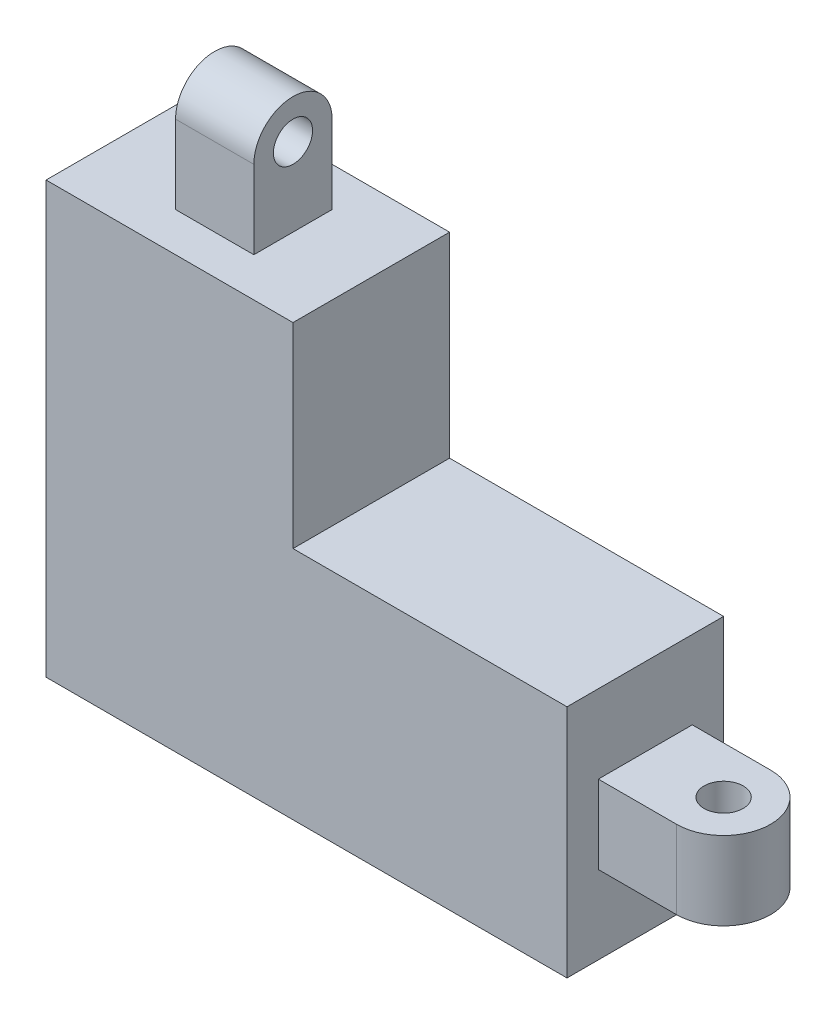
ISO-10303-21;
HEADER;
FILE_DESCRIPTION(('STEP AP214'),'2;1');
FILE_NAME('part.step','',(''),(''),'','','');
FILE_SCHEMA(('AUTOMOTIVE_DESIGN { 1 0 10303 214 1 1 1 1 }'));
ENDSEC;
DATA;
#1=APPLICATION_CONTEXT('core data for automotive mechanical design processes');
#2=APPLICATION_PROTOCOL_DEFINITION('international standard','automotive_design',2000,#1);
#3=PRODUCT_CONTEXT('',#1,'mechanical');
#4=PRODUCT('Part','Part','',(#3));
#5=PRODUCT_RELATED_PRODUCT_CATEGORY('part','',(#4));
#6=PRODUCT_DEFINITION_FORMATION('','',#4);
#7=PRODUCT_DEFINITION_CONTEXT('part definition',#1,'design');
#8=PRODUCT_DEFINITION('design','',#6,#7);
#9=PRODUCT_DEFINITION_SHAPE('','',#8);
#10=(LENGTH_UNIT() NAMED_UNIT(*) SI_UNIT(.MILLI.,.METRE.));
#11=(NAMED_UNIT(*) PLANE_ANGLE_UNIT() SI_UNIT($,.RADIAN.));
#12=(NAMED_UNIT(*) SI_UNIT($,.STERADIAN.) SOLID_ANGLE_UNIT());
#13=UNCERTAINTY_MEASURE_WITH_UNIT(LENGTH_MEASURE(1.E-05),#10,'distance_accuracy_value','');
#14=(GEOMETRIC_REPRESENTATION_CONTEXT(3) GLOBAL_UNCERTAINTY_ASSIGNED_CONTEXT((#13)) GLOBAL_UNIT_ASSIGNED_CONTEXT((#10,
#11,#12)) REPRESENTATION_CONTEXT('',''));
#15=CARTESIAN_POINT('',(0.,0.,0.));
#16=DIRECTION('',(0.,0.,1.));
#17=DIRECTION('',(1.,0.,0.));
#18=AXIS2_PLACEMENT_3D('',#15,#16,#17);
#19=CARTESIAN_POINT('',(48.2562905777485,477.466977070248,15.));
#20=DIRECTION('',(-1.,0.,0.));
#21=DIRECTION('',(0.,-1.,0.));
#22=AXIS2_PLACEMENT_3D('',#19,#20,#21);
#23=PLANE('',#22);
#24=DIRECTION('',(0.,0.,1.));
#25=VECTOR('',#24,1.);
#26=CARTESIAN_POINT('',(48.2562905777423,442.466977070252,-19.));
#27=LINE('',#26,#25);
#28=CARTESIAN_POINT('',(48.2562905777423,442.466977070252,-1.));
#29=VERTEX_POINT('',#28);
#30=CARTESIAN_POINT('',(48.2562905777423,442.466977070252,11.));
#31=VERTEX_POINT('',#30);
#32=EDGE_CURVE('E302',#29,#31,#27,.T.);
#33=ORIENTED_EDGE('',*,*,#32,.F.);
#34=DIRECTION('',(0.,-1.,0.));
#35=VECTOR('',#34,1.);
#36=CARTESIAN_POINT('',(48.2562905776773,-437.808884998721,-1.));
#37=LINE('',#36,#35);
#38=CARTESIAN_POINT('',(48.2562905777423,432.466977070252,-1.));
#39=VERTEX_POINT('',#38);
#40=EDGE_CURVE('E325',#29,#39,#37,.T.);
#41=ORIENTED_EDGE('',*,*,#40,.T.);
#42=DIRECTION('',(0.,0.,1.));
#43=VECTOR('',#42,1.);
#44=CARTESIAN_POINT('',(48.2562905777423,432.466977070252,-19.));
#45=LINE('',#44,#43);
#46=CARTESIAN_POINT('',(48.2562905777423,432.466977070252,11.));
#47=VERTEX_POINT('',#46);
#48=EDGE_CURVE('E298',#39,#47,#45,.T.);
#49=ORIENTED_EDGE('',*,*,#48,.T.);
#50=DIRECTION('',(0.,-1.,0.));
#51=VECTOR('',#50,1.);
#52=CARTESIAN_POINT('',(48.2562905776773,-437.808884998721,11.));
#53=LINE('',#52,#51);
#54=EDGE_CURVE('E209',#31,#47,#53,.T.);
#55=ORIENTED_EDGE('',*,*,#54,.F.);
#56=EDGE_LOOP('',(#33,#41,#49,#55));
#57=FACE_BOUND('',#56,.T.);
#58=DIRECTION('',(0.,0.,1.));
#59=VECTOR('',#58,1.);
#60=CARTESIAN_POINT('',(48.2562905777466,452.466977070253,-15.));
#61=LINE('',#60,#59);
#62=CARTESIAN_POINT('',(48.2562905777466,452.466977070253,-5.));
#63=VERTEX_POINT('',#62);
#64=CARTESIAN_POINT('',(48.2562905777466,452.466977070253,15.));
#65=VERTEX_POINT('',#64);
#66=EDGE_CURVE('E533',#63,#65,#61,.T.);
#67=ORIENTED_EDGE('',*,*,#66,.T.);
#68=DIRECTION('',(0.,1.,0.));
#69=VECTOR('',#68,1.);
#70=CARTESIAN_POINT('',(48.2562905777485,477.466977070248,15.));
#71=LINE('',#70,#69);
#72=CARTESIAN_POINT('',(48.2562905777442,422.466977070253,15.));
#73=VERTEX_POINT('',#72);
#74=EDGE_CURVE('E195',#73,#65,#71,.T.);
#75=ORIENTED_EDGE('',*,*,#74,.F.);
#76=DIRECTION('',(0.,0.,1.));
#77=VECTOR('',#76,1.);
#78=CARTESIAN_POINT('',(48.2562905777442,422.466977070253,-15.));
#79=LINE('',#78,#77);
#80=CARTESIAN_POINT('',(48.2562905777442,422.466977070253,-5.));
#81=VERTEX_POINT('',#80);
#82=EDGE_CURVE('E231',#81,#73,#79,.T.);
#83=ORIENTED_EDGE('',*,*,#82,.F.);
#84=DIRECTION('',(0.,1.,0.));
#85=VECTOR('',#84,1.);
#86=CARTESIAN_POINT('',(48.2562905777485,477.466977070248,-5.));
#87=LINE('',#86,#85);
#88=EDGE_CURVE('E205',#81,#63,#87,.T.);
#89=ORIENTED_EDGE('',*,*,#88,.T.);
#90=EDGE_LOOP('',(#67,#75,#83,#89));
#91=FACE_BOUND('',#90,.T.);
#92=ADVANCED_FACE('F70',(#57,#91),#23,.F.);
#93=CARTESIAN_POINT('',(1.1932964935929,-437.808884998718,15.));
#94=DIRECTION('',(0.,0.,1.));
#95=DIRECTION('',(1.,0.,0.));
#96=AXIS2_PLACEMENT_3D('',#93,#94,#95);
#97=PLANE('',#96);
#98=ORIENTED_EDGE('',*,*,#74,.T.);
#99=DIRECTION('',(-1.,0.,0.));
#100=VECTOR('',#99,1.);
#101=CARTESIAN_POINT('',(0.,452.466977070253,15.));
#102=LINE('',#101,#100);
#103=CARTESIAN_POINT('',(13.2562905777485,452.466977070253,15.));
#104=VERTEX_POINT('',#103);
#105=EDGE_CURVE('E179',#65,#104,#102,.T.);
#106=ORIENTED_EDGE('',*,*,#105,.T.);
#107=DIRECTION('',(0.,-1.,0.));
#108=VECTOR('',#107,1.);
#109=CARTESIAN_POINT('',(13.2562905777485,0.,15.));
#110=LINE('',#109,#108);
#111=CARTESIAN_POINT('',(13.2562905777485,477.466977070248,15.));
#112=VERTEX_POINT('',#111);
#113=EDGE_CURVE('E171',#112,#104,#110,.T.);
#114=ORIENTED_EDGE('',*,*,#113,.F.);
#115=DIRECTION('',(-1.,0.,0.));
#116=VECTOR('',#115,1.);
#117=CARTESIAN_POINT('',(-51.7437094222578,477.466977070248,15.));
#118=LINE('',#117,#116);
#119=CARTESIAN_POINT('',(-18.2788042629838,477.466977070248,15.));
#120=VERTEX_POINT('',#119);
#121=EDGE_CURVE('E186',#112,#120,#118,.T.);
#122=ORIENTED_EDGE('',*,*,#121,.T.);
#123=DIRECTION('',(0.,1.,0.));
#124=VECTOR('',#123,1.);
#125=CARTESIAN_POINT('',(-18.2788042629838,0.,15.));
#126=LINE('',#125,#124);
#127=CARTESIAN_POINT('',(-18.2788042629838,422.466977070253,15.));
#128=VERTEX_POINT('',#127);
#129=EDGE_CURVE('E222',#128,#120,#126,.T.);
#130=ORIENTED_EDGE('',*,*,#129,.F.);
#131=DIRECTION('',(1.,0.,0.));
#132=VECTOR('',#131,1.);
#133=CARTESIAN_POINT('',(0.,422.466977070253,15.));
#134=LINE('',#133,#132);
#135=EDGE_CURVE('E536',#128,#73,#134,.T.);
#136=ORIENTED_EDGE('',*,*,#135,.T.);
#137=EDGE_LOOP('',(#98,#106,#114,#122,#130,#136));
#138=FACE_BOUND('',#137,.T.);
#139=ADVANCED_FACE('F184',(#138),#97,.T.);
#140=CARTESIAN_POINT('',(1.1932964935929,-437.808884998718,-5.));
#141=DIRECTION('',(0.,0.,1.));
#142=DIRECTION('',(1.,0.,0.));
#143=AXIS2_PLACEMENT_3D('',#140,#141,#142);
#144=PLANE('',#143);
#145=DIRECTION('',(-1.,0.,0.));
#146=VECTOR('',#145,1.);
#147=CARTESIAN_POINT('',(1.1932964935929,452.466977070253,-5.));
#148=LINE('',#147,#146);
#149=CARTESIAN_POINT('',(13.2562905777485,452.466977070253,-5.));
#150=VERTEX_POINT('',#149);
#151=EDGE_CURVE('E12',#63,#150,#148,.T.);
#152=ORIENTED_EDGE('',*,*,#151,.F.);
#153=ORIENTED_EDGE('',*,*,#88,.F.);
#154=DIRECTION('',(1.,0.,0.));
#155=VECTOR('',#154,1.);
#156=CARTESIAN_POINT('',(1.1932964935929,422.466977070253,-5.));
#157=LINE('',#156,#155);
#158=CARTESIAN_POINT('',(-18.2788042629838,422.466977070253,-5.));
#159=VERTEX_POINT('',#158);
#160=EDGE_CURVE('E194',#159,#81,#157,.T.);
#161=ORIENTED_EDGE('',*,*,#160,.F.);
#162=DIRECTION('',(0.,1.,0.));
#163=VECTOR('',#162,1.);
#164=CARTESIAN_POINT('',(-18.2788042629838,-437.808884998718,-5.));
#165=LINE('',#164,#163);
#166=CARTESIAN_POINT('',(-18.2788042629838,477.466977070248,-5.));
#167=VERTEX_POINT('',#166);
#168=EDGE_CURVE('E199',#159,#167,#165,.T.);
#169=ORIENTED_EDGE('',*,*,#168,.T.);
#170=DIRECTION('',(-1.,0.,0.));
#171=VECTOR('',#170,1.);
#172=CARTESIAN_POINT('',(-51.7437094222578,477.466977070248,-5.));
#173=LINE('',#172,#171);
#174=CARTESIAN_POINT('',(13.2562905777485,477.466977070248,-5.));
#175=VERTEX_POINT('',#174);
#176=EDGE_CURVE('E201',#175,#167,#173,.T.);
#177=ORIENTED_EDGE('',*,*,#176,.F.);
#178=DIRECTION('',(0.,-1.,0.));
#179=VECTOR('',#178,1.);
#180=CARTESIAN_POINT('',(13.2562905777485,-437.808884998718,-5.));
#181=LINE('',#180,#179);
#182=EDGE_CURVE('E78',#175,#150,#181,.T.);
#183=ORIENTED_EDGE('',*,*,#182,.T.);
#184=EDGE_LOOP('',(#152,#153,#161,#169,#177,#183));
#185=FACE_BOUND('',#184,.T.);
#186=ADVANCED_FACE('F217',(#185),#144,.F.);
#187=CARTESIAN_POINT('',(1.19329649366053,432.466977070257,-5.));
#188=DIRECTION('',(0.,-1.,0.));
#189=DIRECTION('',(1.,0.,0.));
#190=AXIS2_PLACEMENT_3D('',#187,#188,#189);
#191=PLANE('',#190);
#192=CARTESIAN_POINT('',(58.2562905777449,432.466977070253,5.00000000000001));
#193=DIRECTION('',(0.,1.,0.));
#194=DIRECTION('',(-1.,0.,0.));
#195=AXIS2_PLACEMENT_3D('',#192,#193,#194);
#196=CIRCLE('',#195,2.5);
#197=CARTESIAN_POINT('',(55.7562905777449,432.466977070253,5.00000000000001));
#198=VERTEX_POINT('',#197);
#199=EDGE_CURVE('E320',#198,#198,#196,.T.);
#200=ORIENTED_EDGE('',*,*,#199,.T.);
#201=EDGE_LOOP('',(#200));
#202=FACE_BOUND('',#201,.T.);
#203=DIRECTION('',(1.,0.,0.));
#204=VECTOR('',#203,1.);
#205=CARTESIAN_POINT('',(68.2562905776773,432.466977070252,-1.));
#206=LINE('',#205,#204);
#207=CARTESIAN_POINT('',(58.2562905777449,432.466977070253,-1.));
#208=VERTEX_POINT('',#207);
#209=EDGE_CURVE('E307',#39,#208,#206,.T.);
#210=ORIENTED_EDGE('',*,*,#209,.T.);
#211=CARTESIAN_POINT('',(58.2562905777449,432.466977070253,5.00000000000001));
#212=DIRECTION('',(0.,-1.,0.));
#213=DIRECTION('',(1.,0.,0.));
#214=AXIS2_PLACEMENT_3D('',#211,#212,#213);
#215=CIRCLE('',#214,6.00000000000002);
#216=CARTESIAN_POINT('',(58.2562905777449,432.466977070253,11.));
#217=VERTEX_POINT('',#216);
#218=EDGE_CURVE('E241',#208,#217,#215,.T.);
#219=ORIENTED_EDGE('',*,*,#218,.T.);
#220=DIRECTION('',(-1.,0.,0.));
#221=VECTOR('',#220,1.);
#222=CARTESIAN_POINT('',(68.2562905777442,432.466977070252,11.));
#223=LINE('',#222,#221);
#224=EDGE_CURVE('E303',#217,#47,#223,.T.);
#225=ORIENTED_EDGE('',*,*,#224,.T.);
#226=ORIENTED_EDGE('',*,*,#48,.F.);
#227=EDGE_LOOP('',(#210,#219,#225,#226));
#228=FACE_BOUND('',#227,.T.);
#229=ADVANCED_FACE('F344',(#202,#228),#191,.T.);
#230=CARTESIAN_POINT('',(1.19329649366131,442.466977070257,-5.));
#231=DIRECTION('',(0.,-1.,0.));
#232=DIRECTION('',(1.,0.,0.));
#233=AXIS2_PLACEMENT_3D('',#230,#231,#232);
#234=PLANE('',#233);
#235=CARTESIAN_POINT('',(58.2562905777457,442.466977070253,5.00000000000001));
#236=DIRECTION('',(0.,1.,0.));
#237=DIRECTION('',(-1.,0.,0.));
#238=AXIS2_PLACEMENT_3D('',#235,#236,#237);
#239=CIRCLE('',#238,2.5);
#240=CARTESIAN_POINT('',(55.7562905777457,442.466977070253,5.00000000000001));
#241=VERTEX_POINT('',#240);
#242=EDGE_CURVE('E321',#241,#241,#239,.T.);
#243=ORIENTED_EDGE('',*,*,#242,.F.);
#244=EDGE_LOOP('',(#243));
#245=FACE_BOUND('',#244,.T.);
#246=CARTESIAN_POINT('',(58.2562905777457,442.466977070253,5.00000000000001));
#247=DIRECTION('',(0.,1.,0.));
#248=DIRECTION('',(-1.,0.,0.));
#249=AXIS2_PLACEMENT_3D('',#246,#247,#248);
#250=CIRCLE('',#249,6.00000000000002);
#251=CARTESIAN_POINT('',(58.2562905777457,442.466977070253,11.));
#252=VERTEX_POINT('',#251);
#253=CARTESIAN_POINT('',(58.2562905777442,442.466977070252,-1.));
#254=VERTEX_POINT('',#253);
#255=EDGE_CURVE('E224',#252,#254,#250,.T.);
#256=ORIENTED_EDGE('',*,*,#255,.T.);
#257=DIRECTION('',(1.,0.,0.));
#258=VECTOR('',#257,1.);
#259=CARTESIAN_POINT('',(68.2562905776773,442.466977070252,-1.));
#260=LINE('',#259,#258);
#261=EDGE_CURVE('E316',#29,#254,#260,.T.);
#262=ORIENTED_EDGE('',*,*,#261,.F.);
#263=ORIENTED_EDGE('',*,*,#32,.T.);
#264=DIRECTION('',(-1.,0.,0.));
#265=VECTOR('',#264,1.);
#266=CARTESIAN_POINT('',(68.2562905777466,442.466977070252,11.));
#267=LINE('',#266,#265);
#268=EDGE_CURVE('E299',#252,#31,#267,.T.);
#269=ORIENTED_EDGE('',*,*,#268,.F.);
#270=EDGE_LOOP('',(#256,#262,#263,#269));
#271=FACE_BOUND('',#270,.T.);
#272=ADVANCED_FACE('F351',(#245,#271),#234,.F.);
#273=CARTESIAN_POINT('',(-6.74370942226412,497.466977070248,0.));
#274=DIRECTION('',(1.,0.,0.));
#275=DIRECTION('',(0.,0.,-1.));
#276=AXIS2_PLACEMENT_3D('',#273,#274,#275);
#277=PLANE('',#276);
#278=CARTESIAN_POINT('',(-6.74370942226412,487.466977070248,5.));
#279=DIRECTION('',(1.,0.,0.));
#280=DIRECTION('',(0.,0.,-1.));
#281=AXIS2_PLACEMENT_3D('',#278,#279,#280);
#282=CIRCLE('',#281,2.5);
#283=CARTESIAN_POINT('',(-6.74370942226412,487.466977070248,2.5));
#284=VERTEX_POINT('',#283);
#285=EDGE_CURVE('E266',#284,#284,#282,.T.);
#286=ORIENTED_EDGE('',*,*,#285,.T.);
#287=EDGE_LOOP('',(#286));
#288=FACE_BOUND('',#287,.T.);
#289=CARTESIAN_POINT('',(-6.74370942226412,487.466977070248,5.));
#290=DIRECTION('',(1.,0.,0.));
#291=DIRECTION('',(0.,0.,-1.));
#292=AXIS2_PLACEMENT_3D('',#289,#290,#291);
#293=CIRCLE('',#292,5.);
#294=CARTESIAN_POINT('',(-6.74370942226412,487.466977070248,0.));
#295=VERTEX_POINT('',#294);
#296=CARTESIAN_POINT('',(-6.74370942226412,487.466977070248,10.));
#297=VERTEX_POINT('',#296);
#298=EDGE_CURVE('E256',#295,#297,#293,.T.);
#299=ORIENTED_EDGE('',*,*,#298,.F.);
#300=DIRECTION('',(0.,-1.,0.));
#301=VECTOR('',#300,1.);
#302=CARTESIAN_POINT('',(-6.74370942226412,497.466977070248,0.));
#303=LINE('',#302,#301);
#304=CARTESIAN_POINT('',(-6.74370942226412,477.466977070248,0.));
#305=VERTEX_POINT('',#304);
#306=EDGE_CURVE('E286',#295,#305,#303,.T.);
#307=ORIENTED_EDGE('',*,*,#306,.T.);
#308=DIRECTION('',(0.,0.,1.));
#309=VECTOR('',#308,1.);
#310=CARTESIAN_POINT('',(-6.74370942226412,477.466977070248,0.));
#311=LINE('',#310,#309);
#312=CARTESIAN_POINT('',(-6.74370942226412,477.466977070248,10.));
#313=VERTEX_POINT('',#312);
#314=EDGE_CURVE('E270',#305,#313,#311,.T.);
#315=ORIENTED_EDGE('',*,*,#314,.T.);
#316=DIRECTION('',(0.,-1.,0.));
#317=VECTOR('',#316,1.);
#318=CARTESIAN_POINT('',(-6.74370942226412,497.466977070248,10.));
#319=LINE('',#318,#317);
#320=EDGE_CURVE('E295',#297,#313,#319,.T.);
#321=ORIENTED_EDGE('',*,*,#320,.F.);
#322=EDGE_LOOP('',(#299,#307,#315,#321));
#323=FACE_BOUND('',#322,.T.);
#324=ADVANCED_FACE('F353',(#288,#323),#277,.F.);
#325=CARTESIAN_POINT('',(-6.74370942226412,497.466977070248,10.));
#326=DIRECTION('',(0.,0.,-1.));
#327=DIRECTION('',(-1.,0.,0.));
#328=AXIS2_PLACEMENT_3D('',#325,#326,#327);
#329=PLANE('',#328);
#330=DIRECTION('',(1.,0.,0.));
#331=VECTOR('',#330,1.);
#332=CARTESIAN_POINT('',(-16.7437094222515,487.466977070248,10.));
#333=LINE('',#332,#331);
#334=CARTESIAN_POINT('',(3.25629057774849,487.466977070248,10.));
#335=VERTEX_POINT('',#334);
#336=EDGE_CURVE('E253',#297,#335,#333,.T.);
#337=ORIENTED_EDGE('',*,*,#336,.F.);
#338=ORIENTED_EDGE('',*,*,#320,.T.);
#339=DIRECTION('',(1.,0.,0.));
#340=VECTOR('',#339,1.);
#341=CARTESIAN_POINT('',(-6.74370942226412,477.466977070248,10.));
#342=LINE('',#341,#340);
#343=CARTESIAN_POINT('',(3.25629057774849,477.466977070248,10.));
#344=VERTEX_POINT('',#343);
#345=EDGE_CURVE('E274',#313,#344,#342,.T.);
#346=ORIENTED_EDGE('',*,*,#345,.T.);
#347=DIRECTION('',(0.,-1.,0.));
#348=VECTOR('',#347,1.);
#349=CARTESIAN_POINT('',(3.25629057774849,497.466977070248,10.));
#350=LINE('',#349,#348);
#351=EDGE_CURVE('E292',#335,#344,#350,.T.);
#352=ORIENTED_EDGE('',*,*,#351,.F.);
#353=EDGE_LOOP('',(#337,#338,#346,#352));
#354=FACE_BOUND('',#353,.T.);
#355=ADVANCED_FACE('F360',(#354),#329,.F.);
#356=CARTESIAN_POINT('',(3.25629057774849,497.466977070248,0.));
#357=DIRECTION('',(-1.,0.,0.));
#358=DIRECTION('',(0.,0.,1.));
#359=AXIS2_PLACEMENT_3D('',#356,#357,#358);
#360=PLANE('',#359);
#361=CARTESIAN_POINT('',(3.25629057774849,487.466977070248,5.));
#362=DIRECTION('',(1.,0.,0.));
#363=DIRECTION('',(0.,0.,-1.));
#364=AXIS2_PLACEMENT_3D('',#361,#362,#363);
#365=CIRCLE('',#364,2.5);
#366=CARTESIAN_POINT('',(3.25629057774849,487.466977070248,2.5));
#367=VERTEX_POINT('',#366);
#368=EDGE_CURVE('E262',#367,#367,#365,.T.);
#369=ORIENTED_EDGE('',*,*,#368,.F.);
#370=EDGE_LOOP('',(#369));
#371=FACE_BOUND('',#370,.T.);
#372=CARTESIAN_POINT('',(3.25629057774849,487.466977070248,5.));
#373=DIRECTION('',(1.,0.,0.));
#374=DIRECTION('',(0.,0.,-1.));
#375=AXIS2_PLACEMENT_3D('',#372,#373,#374);
#376=CIRCLE('',#375,5.);
#377=CARTESIAN_POINT('',(3.25629057774849,487.466977070248,0.));
#378=VERTEX_POINT('',#377);
#379=EDGE_CURVE('E248',#378,#335,#376,.T.);
#380=ORIENTED_EDGE('',*,*,#379,.T.);
#381=ORIENTED_EDGE('',*,*,#351,.T.);
#382=DIRECTION('',(0.,0.,-1.));
#383=VECTOR('',#382,1.);
#384=CARTESIAN_POINT('',(3.25629057774849,477.466977070248,0.));
#385=LINE('',#384,#383);
#386=CARTESIAN_POINT('',(3.25629057774849,477.466977070248,0.));
#387=VERTEX_POINT('',#386);
#388=EDGE_CURVE('E278',#344,#387,#385,.T.);
#389=ORIENTED_EDGE('',*,*,#388,.T.);
#390=DIRECTION('',(0.,-1.,0.));
#391=VECTOR('',#390,1.);
#392=CARTESIAN_POINT('',(3.25629057774849,497.466977070248,0.));
#393=LINE('',#392,#391);
#394=EDGE_CURVE('E289',#378,#387,#393,.T.);
#395=ORIENTED_EDGE('',*,*,#394,.F.);
#396=EDGE_LOOP('',(#380,#381,#389,#395));
#397=FACE_BOUND('',#396,.T.);
#398=ADVANCED_FACE('F380',(#371,#397),#360,.F.);
#399=CARTESIAN_POINT('',(-51.7437094222578,477.466977070248,15.));
#400=DIRECTION('',(0.,-1.,0.));
#401=DIRECTION('',(0.,0.,-1.));
#402=AXIS2_PLACEMENT_3D('',#399,#400,#401);
#403=PLANE('',#402);
#404=ORIENTED_EDGE('',*,*,#121,.F.);
#405=DIRECTION('',(0.,0.,1.));
#406=VECTOR('',#405,1.);
#407=CARTESIAN_POINT('',(13.2562905777485,477.466977070248,-15.));
#408=LINE('',#407,#406);
#409=EDGE_CURVE('E168',#175,#112,#408,.T.);
#410=ORIENTED_EDGE('',*,*,#409,.F.);
#411=ORIENTED_EDGE('',*,*,#176,.T.);
#412=DIRECTION('',(0.,0.,1.));
#413=VECTOR('',#412,1.);
#414=CARTESIAN_POINT('',(-18.2788042629838,477.466977070248,-15.));
#415=LINE('',#414,#413);
#416=EDGE_CURVE('E192',#167,#120,#415,.T.);
#417=ORIENTED_EDGE('',*,*,#416,.T.);
#418=EDGE_LOOP('',(#404,#410,#411,#417));
#419=FACE_BOUND('',#418,.T.);
#420=ORIENTED_EDGE('',*,*,#314,.F.);
#421=DIRECTION('',(-1.,0.,0.));
#422=VECTOR('',#421,1.);
#423=CARTESIAN_POINT('',(-6.74370942226412,477.466977070248,0.));
#424=LINE('',#423,#422);
#425=EDGE_CURVE('E282',#387,#305,#424,.T.);
#426=ORIENTED_EDGE('',*,*,#425,.F.);
#427=ORIENTED_EDGE('',*,*,#388,.F.);
#428=ORIENTED_EDGE('',*,*,#345,.F.);
#429=EDGE_LOOP('',(#420,#426,#427,#428));
#430=FACE_BOUND('',#429,.T.);
#431=ADVANCED_FACE('F190',(#419,#430),#403,.F.);
#432=CARTESIAN_POINT('',(68.2562905776773,-437.808884998723,-1.));
#433=DIRECTION('',(0.,0.,-1.));
#434=DIRECTION('',(-1.,0.,0.));
#435=AXIS2_PLACEMENT_3D('',#432,#433,#434);
#436=PLANE('',#435);
#437=DIRECTION('',(0.,1.,0.));
#438=VECTOR('',#437,1.);
#439=CARTESIAN_POINT('',(58.2562905777442,422.466977070253,-1.));
#440=LINE('',#439,#438);
#441=EDGE_CURVE('E238',#208,#254,#440,.T.);
#442=ORIENTED_EDGE('',*,*,#441,.F.);
#443=ORIENTED_EDGE('',*,*,#209,.F.);
#444=ORIENTED_EDGE('',*,*,#40,.F.);
#445=ORIENTED_EDGE('',*,*,#261,.T.);
#446=EDGE_LOOP('',(#442,#443,#444,#445));
#447=FACE_BOUND('',#446,.T.);
#448=ADVANCED_FACE('F347',(#447),#436,.T.);
#449=CARTESIAN_POINT('',(68.2562905776773,-437.808884998723,11.));
#450=DIRECTION('',(0.,0.,-1.));
#451=DIRECTION('',(-1.,0.,0.));
#452=AXIS2_PLACEMENT_3D('',#449,#450,#451);
#453=PLANE('',#452);
#454=ORIENTED_EDGE('',*,*,#224,.F.);
#455=DIRECTION('',(0.,1.,0.));
#456=VECTOR('',#455,1.);
#457=CARTESIAN_POINT('',(58.2562905777442,422.466977070253,11.));
#458=LINE('',#457,#456);
#459=EDGE_CURVE('E229',#217,#252,#458,.T.);
#460=ORIENTED_EDGE('',*,*,#459,.T.);
#461=ORIENTED_EDGE('',*,*,#268,.T.);
#462=ORIENTED_EDGE('',*,*,#54,.T.);
#463=EDGE_LOOP('',(#454,#460,#461,#462));
#464=FACE_BOUND('',#463,.T.);
#465=ADVANCED_FACE('F336',(#464),#453,.F.);
#466=CARTESIAN_POINT('',(58.2562905777457,442.466977070253,5.00000000000001));
#467=DIRECTION('',(0.,-1.,0.));
#468=DIRECTION('',(1.,0.,0.));
#469=AXIS2_PLACEMENT_3D('',#466,#467,#468);
#470=CYLINDRICAL_SURFACE('',#469,2.5);
#471=ORIENTED_EDGE('',*,*,#242,.T.);
#472=EDGE_LOOP('',(#471));
#473=FACE_BOUND('',#472,.T.);
#474=ORIENTED_EDGE('',*,*,#199,.F.);
#475=EDGE_LOOP('',(#474));
#476=FACE_BOUND('',#475,.T.);
#477=ADVANCED_FACE('F398',(#473,#476),#470,.F.);
#478=CARTESIAN_POINT('',(-6.74370942226412,497.466977070248,0.));
#479=DIRECTION('',(0.,0.,1.));
#480=DIRECTION('',(1.,0.,0.));
#481=AXIS2_PLACEMENT_3D('',#478,#479,#480);
#482=PLANE('',#481);
#483=ORIENTED_EDGE('',*,*,#306,.F.);
#484=DIRECTION('',(1.,0.,0.));
#485=VECTOR('',#484,1.);
#486=CARTESIAN_POINT('',(-16.7437094222515,487.466977070248,0.));
#487=LINE('',#486,#485);
#488=EDGE_CURVE('E252',#295,#378,#487,.T.);
#489=ORIENTED_EDGE('',*,*,#488,.T.);
#490=ORIENTED_EDGE('',*,*,#394,.T.);
#491=ORIENTED_EDGE('',*,*,#425,.T.);
#492=EDGE_LOOP('',(#483,#489,#490,#491));
#493=FACE_BOUND('',#492,.T.);
#494=ADVANCED_FACE('F396',(#493),#482,.F.);
#495=CARTESIAN_POINT('',(-16.7437094222515,487.466977070248,5.));
#496=DIRECTION('',(1.,0.,0.));
#497=DIRECTION('',(0.,0.,-1.));
#498=AXIS2_PLACEMENT_3D('',#495,#496,#497);
#499=CYLINDRICAL_SURFACE('',#498,2.5);
#500=ORIENTED_EDGE('',*,*,#368,.T.);
#501=EDGE_LOOP('',(#500));
#502=FACE_BOUND('',#501,.T.);
#503=ORIENTED_EDGE('',*,*,#285,.F.);
#504=EDGE_LOOP('',(#503));
#505=FACE_BOUND('',#504,.T.);
#506=ADVANCED_FACE('F405',(#502,#505),#499,.F.);
#507=CARTESIAN_POINT('',(-16.7437094222515,487.466977070248,5.));
#508=DIRECTION('',(1.,0.,0.));
#509=DIRECTION('',(0.,0.,-1.));
#510=AXIS2_PLACEMENT_3D('',#507,#508,#509);
#511=CYLINDRICAL_SURFACE('',#510,5.);
#512=ORIENTED_EDGE('',*,*,#298,.T.);
#513=ORIENTED_EDGE('',*,*,#336,.T.);
#514=ORIENTED_EDGE('',*,*,#379,.F.);
#515=ORIENTED_EDGE('',*,*,#488,.F.);
#516=EDGE_LOOP('',(#512,#513,#514,#515));
#517=FACE_BOUND('',#516,.T.);
#518=ADVANCED_FACE('F453',(#517),#511,.T.);
#519=CARTESIAN_POINT('',(58.2562905777442,422.466977070253,5.00000000000001));
#520=DIRECTION('',(0.,1.,0.));
#521=DIRECTION('',(-1.,0.,0.));
#522=AXIS2_PLACEMENT_3D('',#519,#520,#521);
#523=CYLINDRICAL_SURFACE('',#522,6.00000000000002);
#524=ORIENTED_EDGE('',*,*,#441,.T.);
#525=ORIENTED_EDGE('',*,*,#255,.F.);
#526=ORIENTED_EDGE('',*,*,#459,.F.);
#527=ORIENTED_EDGE('',*,*,#218,.F.);
#528=EDGE_LOOP('',(#524,#525,#526,#527));
#529=FACE_BOUND('',#528,.T.);
#530=ADVANCED_FACE('F349',(#529),#523,.T.);
#531=CARTESIAN_POINT('',(-18.2788042629838,0.,-15.));
#532=DIRECTION('',(1.,0.,0.));
#533=DIRECTION('',(0.,0.,-1.));
#534=AXIS2_PLACEMENT_3D('',#531,#532,#533);
#535=PLANE('',#534);
#536=DIRECTION('',(0.,0.,1.));
#537=VECTOR('',#536,1.);
#538=CARTESIAN_POINT('',(-18.2788042629838,422.466977070253,-15.));
#539=LINE('',#538,#537);
#540=EDGE_CURVE('E92',#159,#128,#539,.T.);
#541=ORIENTED_EDGE('',*,*,#540,.T.);
#542=ORIENTED_EDGE('',*,*,#129,.T.);
#543=ORIENTED_EDGE('',*,*,#416,.F.);
#544=ORIENTED_EDGE('',*,*,#168,.F.);
#545=EDGE_LOOP('',(#541,#542,#543,#544));
#546=FACE_BOUND('',#545,.T.);
#547=ADVANCED_FACE('F221',(#546),#535,.F.);
#548=CARTESIAN_POINT('',(0.,422.466977070253,-15.));
#549=DIRECTION('',(0.,-1.,0.));
#550=DIRECTION('',(0.,0.,-1.));
#551=AXIS2_PLACEMENT_3D('',#548,#549,#550);
#552=PLANE('',#551);
#553=ORIENTED_EDGE('',*,*,#160,.T.);
#554=ORIENTED_EDGE('',*,*,#82,.T.);
#555=ORIENTED_EDGE('',*,*,#135,.F.);
#556=ORIENTED_EDGE('',*,*,#540,.F.);
#557=EDGE_LOOP('',(#553,#554,#555,#556));
#558=FACE_BOUND('',#557,.T.);
#559=ADVANCED_FACE('F500',(#558),#552,.T.);
#560=CARTESIAN_POINT('',(0.,452.466977070253,-15.));
#561=DIRECTION('',(0.,1.,0.));
#562=DIRECTION('',(0.,0.,1.));
#563=AXIS2_PLACEMENT_3D('',#560,#561,#562);
#564=PLANE('',#563);
#565=ORIENTED_EDGE('',*,*,#151,.T.);
#566=DIRECTION('',(0.,0.,1.));
#567=VECTOR('',#566,1.);
#568=CARTESIAN_POINT('',(13.2562905777485,452.466977070253,-15.));
#569=LINE('',#568,#567);
#570=EDGE_CURVE('E85',#150,#104,#569,.T.);
#571=ORIENTED_EDGE('',*,*,#570,.T.);
#572=ORIENTED_EDGE('',*,*,#105,.F.);
#573=ORIENTED_EDGE('',*,*,#66,.F.);
#574=EDGE_LOOP('',(#565,#571,#572,#573));
#575=FACE_BOUND('',#574,.T.);
#576=ADVANCED_FACE('F508',(#575),#564,.T.);
#577=CARTESIAN_POINT('',(13.2562905777485,0.,-15.));
#578=DIRECTION('',(-1.,0.,0.));
#579=DIRECTION('',(0.,0.,1.));
#580=AXIS2_PLACEMENT_3D('',#577,#578,#579);
#581=PLANE('',#580);
#582=ORIENTED_EDGE('',*,*,#409,.T.);
#583=ORIENTED_EDGE('',*,*,#113,.T.);
#584=ORIENTED_EDGE('',*,*,#570,.F.);
#585=ORIENTED_EDGE('',*,*,#182,.F.);
#586=EDGE_LOOP('',(#582,#583,#584,#585));
#587=FACE_BOUND('',#586,.T.);
#588=ADVANCED_FACE('F170',(#587),#581,.F.);
#589=CLOSED_SHELL('',(#92,#139,#186,#229,#272,#324,#355,#398,#431,#448,#465,#477,#494,#506,#518,
#530,#547,#559,#576,#588));
#590=MANIFOLD_SOLID_BREP('B2',#589);
#591=ADVANCED_BREP_SHAPE_REPRESENTATION('',(#18,#590),#14);
#592=SHAPE_DEFINITION_REPRESENTATION(#9,#591);
ENDSEC;
END-ISO-10303-21;
